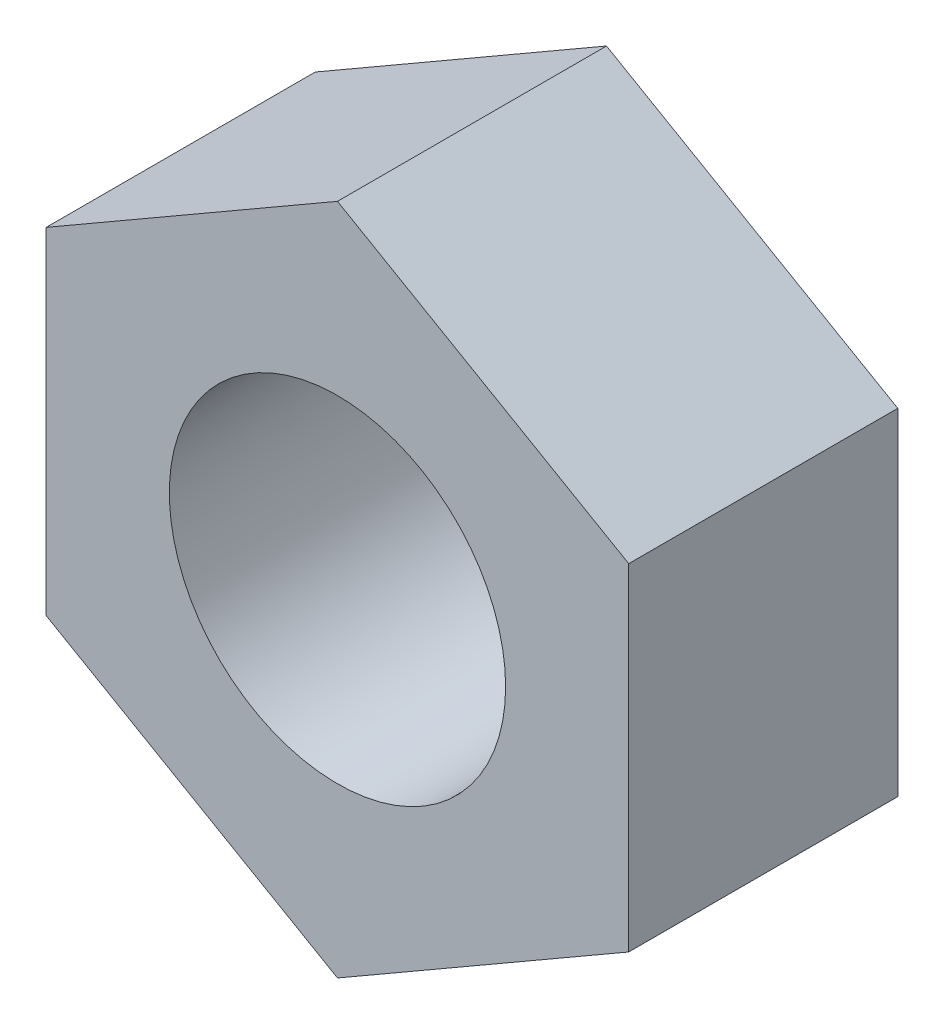
ISO-10303-21;
HEADER;
FILE_DESCRIPTION(('STEP AP214'),'2;1');
FILE_NAME('part.step','',(''),(''),'','','');
FILE_SCHEMA(('AUTOMOTIVE_DESIGN { 1 0 10303 214 1 1 1 1 }'));
ENDSEC;
DATA;
#1=APPLICATION_CONTEXT('core data for automotive mechanical design processes');
#2=APPLICATION_PROTOCOL_DEFINITION('international standard','automotive_design',2000,#1);
#3=PRODUCT_CONTEXT('',#1,'mechanical');
#4=PRODUCT('Part','Part','',(#3));
#5=PRODUCT_RELATED_PRODUCT_CATEGORY('part','',(#4));
#6=PRODUCT_DEFINITION_FORMATION('','',#4);
#7=PRODUCT_DEFINITION_CONTEXT('part definition',#1,'design');
#8=PRODUCT_DEFINITION('design','',#6,#7);
#9=PRODUCT_DEFINITION_SHAPE('','',#8);
#10=(LENGTH_UNIT() NAMED_UNIT(*) SI_UNIT(.MILLI.,.METRE.));
#11=(NAMED_UNIT(*) PLANE_ANGLE_UNIT() SI_UNIT($,.RADIAN.));
#12=(NAMED_UNIT(*) SI_UNIT($,.STERADIAN.) SOLID_ANGLE_UNIT());
#13=UNCERTAINTY_MEASURE_WITH_UNIT(LENGTH_MEASURE(1.E-05),#10,'distance_accuracy_value','');
#14=(GEOMETRIC_REPRESENTATION_CONTEXT(3) GLOBAL_UNCERTAINTY_ASSIGNED_CONTEXT((#13)) GLOBAL_UNIT_ASSIGNED_CONTEXT((#10,
#11,#12)) REPRESENTATION_CONTEXT('',''));
#15=CARTESIAN_POINT('',(0.,0.,0.));
#16=DIRECTION('',(0.,0.,1.));
#17=DIRECTION('',(1.,0.,0.));
#18=AXIS2_PLACEMENT_3D('',#15,#16,#17);
#19=CARTESIAN_POINT('',(0.,0.,4.8));
#20=DIRECTION('',(0.,0.,1.));
#21=DIRECTION('',(1.,0.,0.));
#22=AXIS2_PLACEMENT_3D('',#19,#20,#21);
#23=PLANE('',#22);
#24=DIRECTION('',(-0.866025403784439,0.5,0.));
#25=VECTOR('',#24,1.);
#26=CARTESIAN_POINT('',(5.19615242270663,3.,4.8));
#27=LINE('',#26,#25);
#28=CARTESIAN_POINT('',(5.19615242270663,3.,4.8));
#29=VERTEX_POINT('',#28);
#30=CARTESIAN_POINT('',(0.,6.,4.8));
#31=VERTEX_POINT('',#30);
#32=EDGE_CURVE('E129',#29,#31,#27,.T.);
#33=ORIENTED_EDGE('',*,*,#32,.T.);
#34=DIRECTION('',(-0.866025403784439,-0.5,0.));
#35=VECTOR('',#34,1.);
#36=CARTESIAN_POINT('',(0.,6.,4.8));
#37=LINE('',#36,#35);
#38=CARTESIAN_POINT('',(-5.19615242270663,3.,4.8));
#39=VERTEX_POINT('',#38);
#40=EDGE_CURVE('E87',#31,#39,#37,.T.);
#41=ORIENTED_EDGE('',*,*,#40,.T.);
#42=DIRECTION('',(0.,-1.,0.));
#43=VECTOR('',#42,1.);
#44=CARTESIAN_POINT('',(-5.19615242270663,3.,4.8));
#45=LINE('',#44,#43);
#46=CARTESIAN_POINT('',(-5.19615242270663,-3.,4.8));
#47=VERTEX_POINT('',#46);
#48=EDGE_CURVE('E100',#39,#47,#45,.T.);
#49=ORIENTED_EDGE('',*,*,#48,.T.);
#50=DIRECTION('',(0.866025403784439,-0.5,0.));
#51=VECTOR('',#50,1.);
#52=CARTESIAN_POINT('',(-5.19615242270663,-3.,4.8));
#53=LINE('',#52,#51);
#54=CARTESIAN_POINT('',(0.,-6.,4.8));
#55=VERTEX_POINT('',#54);
#56=EDGE_CURVE('E94',#47,#55,#53,.T.);
#57=ORIENTED_EDGE('',*,*,#56,.T.);
#58=DIRECTION('',(0.866025403784439,0.5,0.));
#59=VECTOR('',#58,1.);
#60=CARTESIAN_POINT('',(0.,-6.,4.8));
#61=LINE('',#60,#59);
#62=CARTESIAN_POINT('',(5.19615242270663,-3.,4.8));
#63=VERTEX_POINT('',#62);
#64=EDGE_CURVE('E98',#55,#63,#61,.T.);
#65=ORIENTED_EDGE('',*,*,#64,.T.);
#66=DIRECTION('',(0.,1.,0.));
#67=VECTOR('',#66,1.);
#68=CARTESIAN_POINT('',(5.19615242270663,-3.,4.8));
#69=LINE('',#68,#67);
#70=EDGE_CURVE('E50',#63,#29,#69,.T.);
#71=ORIENTED_EDGE('',*,*,#70,.T.);
#72=EDGE_LOOP('',(#33,#41,#49,#57,#65,#71));
#73=FACE_BOUND('',#72,.T.);
#74=CARTESIAN_POINT('',(0.,0.,4.8));
#75=DIRECTION('',(0.,0.,1.));
#76=DIRECTION('',(1.,0.,0.));
#77=AXIS2_PLACEMENT_3D('',#74,#75,#76);
#78=CIRCLE('',#77,3.);
#79=CARTESIAN_POINT('',(3.,0.,4.8));
#80=VERTEX_POINT('',#79);
#81=EDGE_CURVE('E122',#80,#80,#78,.T.);
#82=ORIENTED_EDGE('',*,*,#81,.F.);
#83=EDGE_LOOP('',(#82));
#84=FACE_BOUND('',#83,.T.);
#85=ADVANCED_FACE('F33',(#73,#84),#23,.T.);
#86=CARTESIAN_POINT('',(0.,0.,0.));
#87=DIRECTION('',(0.,0.,1.));
#88=DIRECTION('',(1.,0.,0.));
#89=AXIS2_PLACEMENT_3D('',#86,#87,#88);
#90=PLANE('',#89);
#91=DIRECTION('',(-0.866025403784439,0.5,0.));
#92=VECTOR('',#91,1.);
#93=CARTESIAN_POINT('',(5.19615242270663,3.,0.));
#94=LINE('',#93,#92);
#95=CARTESIAN_POINT('',(5.19615242270663,3.,0.));
#96=VERTEX_POINT('',#95);
#97=CARTESIAN_POINT('',(0.,6.,0.));
#98=VERTEX_POINT('',#97);
#99=EDGE_CURVE('E118',#96,#98,#94,.T.);
#100=ORIENTED_EDGE('',*,*,#99,.F.);
#101=DIRECTION('',(0.,1.,0.));
#102=VECTOR('',#101,1.);
#103=CARTESIAN_POINT('',(5.19615242270663,-3.,0.));
#104=LINE('',#103,#102);
#105=CARTESIAN_POINT('',(5.19615242270663,-3.,0.));
#106=VERTEX_POINT('',#105);
#107=EDGE_CURVE('E79',#106,#96,#104,.T.);
#108=ORIENTED_EDGE('',*,*,#107,.F.);
#109=DIRECTION('',(0.866025403784439,0.5,0.));
#110=VECTOR('',#109,1.);
#111=CARTESIAN_POINT('',(0.,-6.,0.));
#112=LINE('',#111,#110);
#113=CARTESIAN_POINT('',(0.,-6.,0.));
#114=VERTEX_POINT('',#113);
#115=EDGE_CURVE('E73',#114,#106,#112,.T.);
#116=ORIENTED_EDGE('',*,*,#115,.F.);
#117=DIRECTION('',(0.866025403784439,-0.5,0.));
#118=VECTOR('',#117,1.);
#119=CARTESIAN_POINT('',(-5.19615242270663,-3.,0.));
#120=LINE('',#119,#118);
#121=CARTESIAN_POINT('',(-5.19615242270663,-3.,0.));
#122=VERTEX_POINT('',#121);
#123=EDGE_CURVE('E108',#122,#114,#120,.T.);
#124=ORIENTED_EDGE('',*,*,#123,.F.);
#125=DIRECTION('',(0.,-1.,0.));
#126=VECTOR('',#125,1.);
#127=CARTESIAN_POINT('',(-5.19615242270663,3.,0.));
#128=LINE('',#127,#126);
#129=CARTESIAN_POINT('',(-5.19615242270663,3.,0.));
#130=VERTEX_POINT('',#129);
#131=EDGE_CURVE('E124',#130,#122,#128,.T.);
#132=ORIENTED_EDGE('',*,*,#131,.F.);
#133=DIRECTION('',(-0.866025403784439,-0.5,0.));
#134=VECTOR('',#133,1.);
#135=CARTESIAN_POINT('',(0.,6.,0.));
#136=LINE('',#135,#134);
#137=EDGE_CURVE('E121',#98,#130,#136,.T.);
#138=ORIENTED_EDGE('',*,*,#137,.F.);
#139=EDGE_LOOP('',(#100,#108,#116,#124,#132,#138));
#140=FACE_BOUND('',#139,.T.);
#141=CARTESIAN_POINT('',(0.,0.,0.));
#142=DIRECTION('',(0.,0.,1.));
#143=DIRECTION('',(1.,0.,0.));
#144=AXIS2_PLACEMENT_3D('',#141,#142,#143);
#145=CIRCLE('',#144,3.);
#146=CARTESIAN_POINT('',(3.,0.,0.));
#147=VERTEX_POINT('',#146);
#148=EDGE_CURVE('E222',#147,#147,#145,.T.);
#149=ORIENTED_EDGE('',*,*,#148,.T.);
#150=EDGE_LOOP('',(#149));
#151=FACE_BOUND('',#150,.T.);
#152=ADVANCED_FACE('F138',(#140,#151),#90,.F.);
#153=CARTESIAN_POINT('',(5.19615242270663,3.,4.8));
#154=DIRECTION('',(-0.5,-0.866025403784439,0.));
#155=DIRECTION('',(0.866025403784439,-0.5,0.));
#156=AXIS2_PLACEMENT_3D('',#153,#154,#155);
#157=PLANE('',#156);
#158=ORIENTED_EDGE('',*,*,#99,.T.);
#159=DIRECTION('',(0.,0.,-1.));
#160=VECTOR('',#159,1.);
#161=CARTESIAN_POINT('',(0.,6.,4.8));
#162=LINE('',#161,#160);
#163=EDGE_CURVE('E11',#31,#98,#162,.T.);
#164=ORIENTED_EDGE('',*,*,#163,.F.);
#165=ORIENTED_EDGE('',*,*,#32,.F.);
#166=DIRECTION('',(0.,0.,-1.));
#167=VECTOR('',#166,1.);
#168=CARTESIAN_POINT('',(5.19615242270663,3.,4.8));
#169=LINE('',#168,#167);
#170=EDGE_CURVE('E114',#29,#96,#169,.T.);
#171=ORIENTED_EDGE('',*,*,#170,.T.);
#172=EDGE_LOOP('',(#158,#164,#165,#171));
#173=FACE_BOUND('',#172,.T.);
#174=ADVANCED_FACE('F35',(#173),#157,.F.);
#175=CARTESIAN_POINT('',(0.,6.,4.8));
#176=DIRECTION('',(0.5,-0.866025403784439,0.));
#177=DIRECTION('',(0.866025403784439,0.5,0.));
#178=AXIS2_PLACEMENT_3D('',#175,#176,#177);
#179=PLANE('',#178);
#180=ORIENTED_EDGE('',*,*,#137,.T.);
#181=DIRECTION('',(0.,0.,-1.));
#182=VECTOR('',#181,1.);
#183=CARTESIAN_POINT('',(-5.19615242270663,3.,4.8));
#184=LINE('',#183,#182);
#185=EDGE_CURVE('E42',#39,#130,#184,.T.);
#186=ORIENTED_EDGE('',*,*,#185,.F.);
#187=ORIENTED_EDGE('',*,*,#40,.F.);
#188=ORIENTED_EDGE('',*,*,#163,.T.);
#189=EDGE_LOOP('',(#180,#186,#187,#188));
#190=FACE_BOUND('',#189,.T.);
#191=ADVANCED_FACE('F163',(#190),#179,.F.);
#192=CARTESIAN_POINT('',(-5.19615242270663,3.,4.8));
#193=DIRECTION('',(1.,0.,0.));
#194=DIRECTION('',(0.,1.,0.));
#195=AXIS2_PLACEMENT_3D('',#192,#193,#194);
#196=PLANE('',#195);
#197=ORIENTED_EDGE('',*,*,#131,.T.);
#198=DIRECTION('',(0.,0.,-1.));
#199=VECTOR('',#198,1.);
#200=CARTESIAN_POINT('',(-5.19615242270663,-3.,4.8));
#201=LINE('',#200,#199);
#202=EDGE_CURVE('E109',#47,#122,#201,.T.);
#203=ORIENTED_EDGE('',*,*,#202,.F.);
#204=ORIENTED_EDGE('',*,*,#48,.F.);
#205=ORIENTED_EDGE('',*,*,#185,.T.);
#206=EDGE_LOOP('',(#197,#203,#204,#205));
#207=FACE_BOUND('',#206,.T.);
#208=ADVANCED_FACE('F135',(#207),#196,.F.);
#209=CARTESIAN_POINT('',(-5.19615242270663,-3.,4.8));
#210=DIRECTION('',(0.5,0.866025403784439,0.));
#211=DIRECTION('',(-0.866025403784439,0.5,0.));
#212=AXIS2_PLACEMENT_3D('',#209,#210,#211);
#213=PLANE('',#212);
#214=ORIENTED_EDGE('',*,*,#123,.T.);
#215=DIRECTION('',(0.,0.,-1.));
#216=VECTOR('',#215,1.);
#217=CARTESIAN_POINT('',(0.,-6.,4.8));
#218=LINE('',#217,#216);
#219=EDGE_CURVE('E105',#55,#114,#218,.T.);
#220=ORIENTED_EDGE('',*,*,#219,.F.);
#221=ORIENTED_EDGE('',*,*,#56,.F.);
#222=ORIENTED_EDGE('',*,*,#202,.T.);
#223=EDGE_LOOP('',(#214,#220,#221,#222));
#224=FACE_BOUND('',#223,.T.);
#225=ADVANCED_FACE('F106',(#224),#213,.F.);
#226=CARTESIAN_POINT('',(0.,-6.,4.8));
#227=DIRECTION('',(-0.5,0.866025403784439,0.));
#228=DIRECTION('',(-0.866025403784439,-0.5,0.));
#229=AXIS2_PLACEMENT_3D('',#226,#227,#228);
#230=PLANE('',#229);
#231=ORIENTED_EDGE('',*,*,#115,.T.);
#232=DIRECTION('',(0.,0.,-1.));
#233=VECTOR('',#232,1.);
#234=CARTESIAN_POINT('',(5.19615242270663,-3.,4.8));
#235=LINE('',#234,#233);
#236=EDGE_CURVE('E110',#63,#106,#235,.T.);
#237=ORIENTED_EDGE('',*,*,#236,.F.);
#238=ORIENTED_EDGE('',*,*,#64,.F.);
#239=ORIENTED_EDGE('',*,*,#219,.T.);
#240=EDGE_LOOP('',(#231,#237,#238,#239));
#241=FACE_BOUND('',#240,.T.);
#242=ADVANCED_FACE('F112',(#241),#230,.F.);
#243=CARTESIAN_POINT('',(5.19615242270663,-3.,4.8));
#244=DIRECTION('',(-1.,0.,0.));
#245=DIRECTION('',(0.,0.,1.));
#246=AXIS2_PLACEMENT_3D('',#243,#244,#245);
#247=PLANE('',#246);
#248=ORIENTED_EDGE('',*,*,#107,.T.);
#249=ORIENTED_EDGE('',*,*,#170,.F.);
#250=ORIENTED_EDGE('',*,*,#70,.F.);
#251=ORIENTED_EDGE('',*,*,#236,.T.);
#252=EDGE_LOOP('',(#248,#249,#250,#251));
#253=FACE_BOUND('',#252,.T.);
#254=ADVANCED_FACE('F143',(#253),#247,.F.);
#255=CARTESIAN_POINT('',(0.,0.,4.8));
#256=DIRECTION('',(0.,0.,-1.));
#257=DIRECTION('',(-1.,0.,0.));
#258=AXIS2_PLACEMENT_3D('',#255,#256,#257);
#259=CYLINDRICAL_SURFACE('',#258,3.);
#260=ORIENTED_EDGE('',*,*,#81,.T.);
#261=EDGE_LOOP('',(#260));
#262=FACE_BOUND('',#261,.T.);
#263=ORIENTED_EDGE('',*,*,#148,.F.);
#264=EDGE_LOOP('',(#263));
#265=FACE_BOUND('',#264,.T.);
#266=ADVANCED_FACE('F145',(#262,#265),#259,.F.);
#267=CLOSED_SHELL('',(#85,#152,#174,#191,#208,#225,#242,#254,#266));
#268=MANIFOLD_SOLID_BREP('B2',#267);
#269=ADVANCED_BREP_SHAPE_REPRESENTATION('',(#18,#268),#14);
#270=SHAPE_DEFINITION_REPRESENTATION(#9,#269);
ENDSEC;
END-ISO-10303-21;
